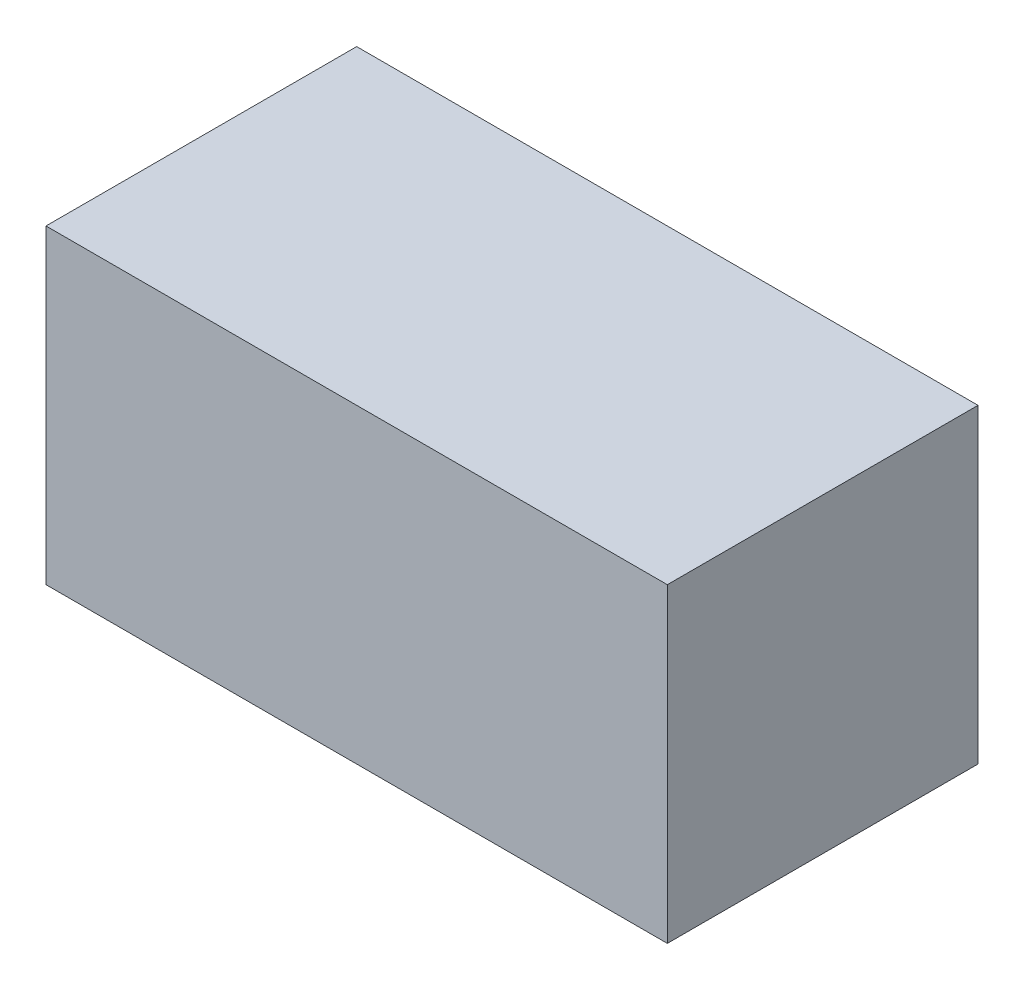
ISO-10303-21;
HEADER;
FILE_DESCRIPTION(('STEP AP214'),'2;1');
FILE_NAME('part.step','',(''),(''),'','','');
FILE_SCHEMA(('AUTOMOTIVE_DESIGN { 1 0 10303 214 1 1 1 1 }'));
ENDSEC;
DATA;
#1=APPLICATION_CONTEXT('core data for automotive mechanical design processes');
#2=APPLICATION_PROTOCOL_DEFINITION('international standard','automotive_design',2000,#1);
#3=PRODUCT_CONTEXT('',#1,'mechanical');
#4=PRODUCT('Part','Part','',(#3));
#5=PRODUCT_RELATED_PRODUCT_CATEGORY('part','',(#4));
#6=PRODUCT_DEFINITION_FORMATION('','',#4);
#7=PRODUCT_DEFINITION_CONTEXT('part definition',#1,'design');
#8=PRODUCT_DEFINITION('design','',#6,#7);
#9=PRODUCT_DEFINITION_SHAPE('','',#8);
#10=(LENGTH_UNIT() NAMED_UNIT(*) SI_UNIT(.MILLI.,.METRE.));
#11=(NAMED_UNIT(*) PLANE_ANGLE_UNIT() SI_UNIT($,.RADIAN.));
#12=(NAMED_UNIT(*) SI_UNIT($,.STERADIAN.) SOLID_ANGLE_UNIT());
#13=UNCERTAINTY_MEASURE_WITH_UNIT(LENGTH_MEASURE(1.E-05),#10,'distance_accuracy_value','');
#14=(GEOMETRIC_REPRESENTATION_CONTEXT(3) GLOBAL_UNCERTAINTY_ASSIGNED_CONTEXT((#13)) GLOBAL_UNIT_ASSIGNED_CONTEXT((#10,
#11,#12)) REPRESENTATION_CONTEXT('',''));
#15=CARTESIAN_POINT('',(0.,0.,0.));
#16=DIRECTION('',(0.,0.,1.));
#17=DIRECTION('',(1.,0.,0.));
#18=AXIS2_PLACEMENT_3D('',#15,#16,#17);
#19=CARTESIAN_POINT('',(0.,0.4,0.));
#20=DIRECTION('',(1.,0.,0.));
#21=DIRECTION('',(0.,0.,-1.));
#22=AXIS2_PLACEMENT_3D('',#19,#20,#21);
#23=PLANE('',#22);
#24=DIRECTION('',(0.,0.,1.));
#25=VECTOR('',#24,1.);
#26=CARTESIAN_POINT('',(0.,0.,0.));
#27=LINE('',#26,#25);
#28=CARTESIAN_POINT('',(0.,0.,-0.4));
#29=VERTEX_POINT('',#28);
#30=CARTESIAN_POINT('',(0.,0.,0.));
#31=VERTEX_POINT('',#30);
#32=EDGE_CURVE('E96',#29,#31,#27,.T.);
#33=ORIENTED_EDGE('',*,*,#32,.T.);
#34=DIRECTION('',(0.,-1.,0.));
#35=VECTOR('',#34,1.);
#36=CARTESIAN_POINT('',(0.,0.4,0.));
#37=LINE('',#36,#35);
#38=CARTESIAN_POINT('',(0.,0.4,0.));
#39=VERTEX_POINT('',#38);
#40=EDGE_CURVE('E11',#39,#31,#37,.T.);
#41=ORIENTED_EDGE('',*,*,#40,.F.);
#42=DIRECTION('',(0.,0.,1.));
#43=VECTOR('',#42,1.);
#44=CARTESIAN_POINT('',(0.,0.4,0.));
#45=LINE('',#44,#43);
#46=CARTESIAN_POINT('',(0.,0.4,-0.4));
#47=VERTEX_POINT('',#46);
#48=EDGE_CURVE('E84',#47,#39,#45,.T.);
#49=ORIENTED_EDGE('',*,*,#48,.F.);
#50=DIRECTION('',(0.,-1.,0.));
#51=VECTOR('',#50,1.);
#52=CARTESIAN_POINT('',(0.,0.4,-0.4));
#53=LINE('',#52,#51);
#54=EDGE_CURVE('E92',#47,#29,#53,.T.);
#55=ORIENTED_EDGE('',*,*,#54,.T.);
#56=EDGE_LOOP('',(#33,#41,#49,#55));
#57=FACE_BOUND('',#56,.T.);
#58=ADVANCED_FACE('F33',(#57),#23,.F.);
#59=CARTESIAN_POINT('',(0.,0.4,0.));
#60=DIRECTION('',(0.,0.,-1.));
#61=DIRECTION('',(-1.,0.,0.));
#62=AXIS2_PLACEMENT_3D('',#59,#60,#61);
#63=PLANE('',#62);
#64=DIRECTION('',(1.,0.,0.));
#65=VECTOR('',#64,1.);
#66=CARTESIAN_POINT('',(0.,0.,0.));
#67=LINE('',#66,#65);
#68=CARTESIAN_POINT('',(0.8,0.,0.));
#69=VERTEX_POINT('',#68);
#70=EDGE_CURVE('E88',#31,#69,#67,.T.);
#71=ORIENTED_EDGE('',*,*,#70,.T.);
#72=DIRECTION('',(0.,-1.,0.));
#73=VECTOR('',#72,1.);
#74=CARTESIAN_POINT('',(0.8,0.4,0.));
#75=LINE('',#74,#73);
#76=CARTESIAN_POINT('',(0.8,0.4,0.));
#77=VERTEX_POINT('',#76);
#78=EDGE_CURVE('E41',#77,#69,#75,.T.);
#79=ORIENTED_EDGE('',*,*,#78,.F.);
#80=DIRECTION('',(1.,0.,0.));
#81=VECTOR('',#80,1.);
#82=CARTESIAN_POINT('',(0.,0.4,0.));
#83=LINE('',#82,#81);
#84=EDGE_CURVE('E79',#39,#77,#83,.T.);
#85=ORIENTED_EDGE('',*,*,#84,.F.);
#86=ORIENTED_EDGE('',*,*,#40,.T.);
#87=EDGE_LOOP('',(#71,#79,#85,#86));
#88=FACE_BOUND('',#87,.T.);
#89=ADVANCED_FACE('F87',(#88),#63,.F.);
#90=CARTESIAN_POINT('',(0.8,0.4,0.));
#91=DIRECTION('',(-1.,0.,0.));
#92=DIRECTION('',(0.,0.,1.));
#93=AXIS2_PLACEMENT_3D('',#90,#91,#92);
#94=PLANE('',#93);
#95=DIRECTION('',(0.,0.,-1.));
#96=VECTOR('',#95,1.);
#97=CARTESIAN_POINT('',(0.8,0.,0.));
#98=LINE('',#97,#96);
#99=CARTESIAN_POINT('',(0.8,0.,-0.4));
#100=VERTEX_POINT('',#99);
#101=EDGE_CURVE('E66',#69,#100,#98,.T.);
#102=ORIENTED_EDGE('',*,*,#101,.T.);
#103=DIRECTION('',(0.,-1.,0.));
#104=VECTOR('',#103,1.);
#105=CARTESIAN_POINT('',(0.8,0.4,-0.4));
#106=LINE('',#105,#104);
#107=CARTESIAN_POINT('',(0.8,0.4,-0.4));
#108=VERTEX_POINT('',#107);
#109=EDGE_CURVE('E89',#108,#100,#106,.T.);
#110=ORIENTED_EDGE('',*,*,#109,.F.);
#111=DIRECTION('',(0.,0.,-1.));
#112=VECTOR('',#111,1.);
#113=CARTESIAN_POINT('',(0.8,0.4,0.));
#114=LINE('',#113,#112);
#115=EDGE_CURVE('E82',#77,#108,#114,.T.);
#116=ORIENTED_EDGE('',*,*,#115,.F.);
#117=ORIENTED_EDGE('',*,*,#78,.T.);
#118=EDGE_LOOP('',(#102,#110,#116,#117));
#119=FACE_BOUND('',#118,.T.);
#120=ADVANCED_FACE('F90',(#119),#94,.F.);
#121=CARTESIAN_POINT('',(0.,0.4,-0.4));
#122=DIRECTION('',(0.,0.,1.));
#123=DIRECTION('',(1.,0.,0.));
#124=AXIS2_PLACEMENT_3D('',#121,#122,#123);
#125=PLANE('',#124);
#126=DIRECTION('',(-1.,0.,0.));
#127=VECTOR('',#126,1.);
#128=CARTESIAN_POINT('',(0.,0.,-0.4));
#129=LINE('',#128,#127);
#130=EDGE_CURVE('E72',#100,#29,#129,.T.);
#131=ORIENTED_EDGE('',*,*,#130,.T.);
#132=ORIENTED_EDGE('',*,*,#54,.F.);
#133=DIRECTION('',(-1.,0.,0.));
#134=VECTOR('',#133,1.);
#135=CARTESIAN_POINT('',(0.,0.4,-0.4));
#136=LINE('',#135,#134);
#137=EDGE_CURVE('E49',#108,#47,#136,.T.);
#138=ORIENTED_EDGE('',*,*,#137,.F.);
#139=ORIENTED_EDGE('',*,*,#109,.T.);
#140=EDGE_LOOP('',(#131,#132,#138,#139));
#141=FACE_BOUND('',#140,.T.);
#142=ADVANCED_FACE('F103',(#141),#125,.F.);
#143=CARTESIAN_POINT('',(0.,0.4,0.));
#144=DIRECTION('',(0.,-1.,0.));
#145=DIRECTION('',(0.,0.,-1.));
#146=AXIS2_PLACEMENT_3D('',#143,#144,#145);
#147=PLANE('',#146);
#148=ORIENTED_EDGE('',*,*,#48,.T.);
#149=ORIENTED_EDGE('',*,*,#84,.T.);
#150=ORIENTED_EDGE('',*,*,#115,.T.);
#151=ORIENTED_EDGE('',*,*,#137,.T.);
#152=EDGE_LOOP('',(#148,#149,#150,#151));
#153=FACE_BOUND('',#152,.T.);
#154=ADVANCED_FACE('F80',(#153),#147,.F.);
#155=CARTESIAN_POINT('',(0.,0.,0.));
#156=DIRECTION('',(0.,-1.,0.));
#157=DIRECTION('',(0.,0.,-1.));
#158=AXIS2_PLACEMENT_3D('',#155,#156,#157);
#159=PLANE('',#158);
#160=ORIENTED_EDGE('',*,*,#32,.F.);
#161=ORIENTED_EDGE('',*,*,#130,.F.);
#162=ORIENTED_EDGE('',*,*,#101,.F.);
#163=ORIENTED_EDGE('',*,*,#70,.F.);
#164=EDGE_LOOP('',(#160,#161,#162,#163));
#165=FACE_BOUND('',#164,.T.);
#166=ADVANCED_FACE('F106',(#165),#159,.T.);
#167=CLOSED_SHELL('',(#58,#89,#120,#142,#154,#166));
#168=MANIFOLD_SOLID_BREP('B2',#167);
#169=ADVANCED_BREP_SHAPE_REPRESENTATION('',(#18,#168),#14);
#170=SHAPE_DEFINITION_REPRESENTATION(#9,#169);
ENDSEC;
END-ISO-10303-21;
